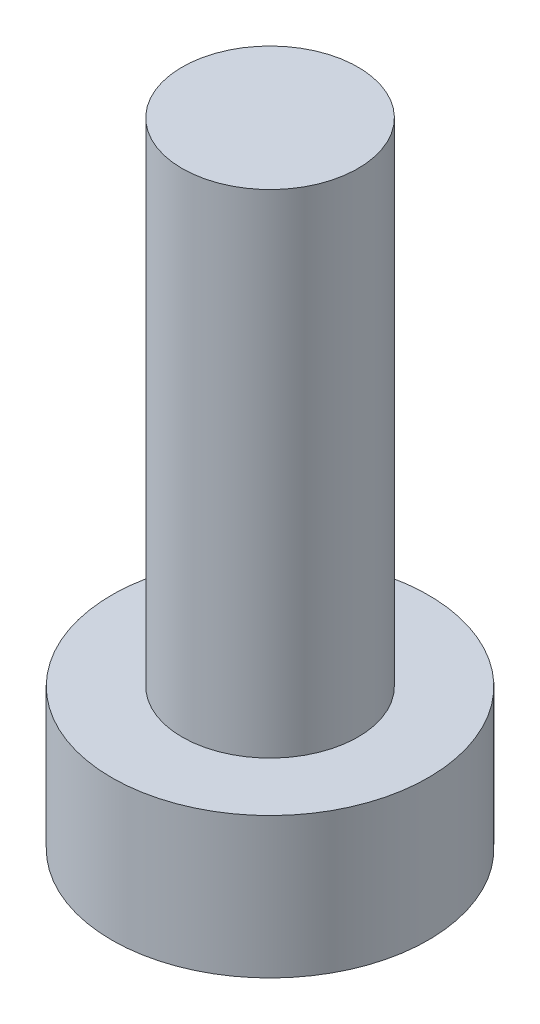
ISO-10303-21;
HEADER;
FILE_DESCRIPTION(('STEP AP214'),'2;1');
FILE_NAME('part.step','',(''),(''),'','','');
FILE_SCHEMA(('AUTOMOTIVE_DESIGN { 1 0 10303 214 1 1 1 1 }'));
ENDSEC;
DATA;
#1=APPLICATION_CONTEXT('core data for automotive mechanical design processes');
#2=APPLICATION_PROTOCOL_DEFINITION('international standard','automotive_design',2000,#1);
#3=PRODUCT_CONTEXT('',#1,'mechanical');
#4=PRODUCT('Part','Part','',(#3));
#5=PRODUCT_RELATED_PRODUCT_CATEGORY('part','',(#4));
#6=PRODUCT_DEFINITION_FORMATION('','',#4);
#7=PRODUCT_DEFINITION_CONTEXT('part definition',#1,'design');
#8=PRODUCT_DEFINITION('design','',#6,#7);
#9=PRODUCT_DEFINITION_SHAPE('','',#8);
#10=(LENGTH_UNIT() NAMED_UNIT(*) SI_UNIT(.MILLI.,.METRE.));
#11=(NAMED_UNIT(*) PLANE_ANGLE_UNIT() SI_UNIT($,.RADIAN.));
#12=(NAMED_UNIT(*) SI_UNIT($,.STERADIAN.) SOLID_ANGLE_UNIT());
#13=UNCERTAINTY_MEASURE_WITH_UNIT(LENGTH_MEASURE(1.E-05),#10,'distance_accuracy_value','');
#14=(GEOMETRIC_REPRESENTATION_CONTEXT(3) GLOBAL_UNCERTAINTY_ASSIGNED_CONTEXT((#13)) GLOBAL_UNIT_ASSIGNED_CONTEXT((#10,
#11,#12)) REPRESENTATION_CONTEXT('',''));
#15=CARTESIAN_POINT('',(0.,0.,0.));
#16=DIRECTION('',(0.,0.,1.));
#17=DIRECTION('',(1.,0.,0.));
#18=AXIS2_PLACEMENT_3D('',#15,#16,#17);
#19=CARTESIAN_POINT('',(26.,-132.,59.966679003209));
#20=DIRECTION('',(0.,1.,0.));
#21=DIRECTION('',(1.,0.,0.));
#22=AXIS2_PLACEMENT_3D('',#19,#20,#21);
#23=PLANE('',#22);
#24=CARTESIAN_POINT('',(26.,-132.,59.966679003209));
#25=DIRECTION('',(0.,1.,0.));
#26=DIRECTION('',(0.,0.,1.));
#27=AXIS2_PLACEMENT_3D('',#24,#25,#26);
#28=CIRCLE('',#27,2.5);
#29=CARTESIAN_POINT('',(26.,-132.,62.466679003209));
#30=VERTEX_POINT('',#29);
#31=EDGE_CURVE('E27',#30,#30,#28,.T.);
#32=ORIENTED_EDGE('',*,*,#31,.T.);
#33=EDGE_LOOP('',(#32));
#34=FACE_BOUND('',#33,.T.);
#35=ADVANCED_FACE('F16',(#34),#23,.T.);
#36=CARTESIAN_POINT('',(26.,-146.,59.966679003209));
#37=DIRECTION('',(0.,1.,0.));
#38=DIRECTION('',(0.,0.,1.));
#39=AXIS2_PLACEMENT_3D('',#36,#37,#38);
#40=CYLINDRICAL_SURFACE('',#39,2.5);
#41=ORIENTED_EDGE('',*,*,#31,.F.);
#42=DIRECTION('',(0.,1.,0.));
#43=VECTOR('',#42,1.);
#44=CARTESIAN_POINT('',(26.,-146.,62.466679003209));
#45=LINE('',#44,#43);
#46=CARTESIAN_POINT('',(26.,-146.,62.466679003209));
#47=VERTEX_POINT('',#46);
#48=EDGE_CURVE('E10',#47,#30,#45,.T.);
#49=ORIENTED_EDGE('',*,*,#48,.F.);
#50=CARTESIAN_POINT('',(26.,-146.,59.966679003209));
#51=DIRECTION('',(0.,1.,0.));
#52=DIRECTION('',(0.,0.,1.));
#53=AXIS2_PLACEMENT_3D('',#50,#51,#52);
#54=CIRCLE('',#53,2.5);
#55=EDGE_CURVE('E56',#47,#47,#54,.T.);
#56=ORIENTED_EDGE('',*,*,#55,.T.);
#57=ORIENTED_EDGE('',*,*,#48,.T.);
#58=EDGE_LOOP('',(#41,#49,#56,#57));
#59=FACE_BOUND('',#58,.T.);
#60=ADVANCED_FACE('F79',(#59),#40,.T.);
#61=CARTESIAN_POINT('',(26.,-150.,59.966679003209));
#62=DIRECTION('',(0.,1.,0.));
#63=DIRECTION('',(1.,0.,0.));
#64=AXIS2_PLACEMENT_3D('',#61,#62,#63);
#65=PLANE('',#64);
#66=CARTESIAN_POINT('',(26.,-150.,59.966679003209));
#67=DIRECTION('',(0.,1.,0.));
#68=DIRECTION('',(0.,0.,1.));
#69=AXIS2_PLACEMENT_3D('',#66,#67,#68);
#70=CIRCLE('',#69,4.5);
#71=CARTESIAN_POINT('',(26.,-150.,64.466679003209));
#72=VERTEX_POINT('',#71);
#73=EDGE_CURVE('E53',#72,#72,#70,.T.);
#74=ORIENTED_EDGE('',*,*,#73,.F.);
#75=EDGE_LOOP('',(#74));
#76=FACE_BOUND('',#75,.T.);
#77=ADVANCED_FACE('F71',(#76),#65,.F.);
#78=CARTESIAN_POINT('',(26.,-146.,59.966679003209));
#79=DIRECTION('',(0.,1.,0.));
#80=DIRECTION('',(1.,0.,0.));
#81=AXIS2_PLACEMENT_3D('',#78,#79,#80);
#82=PLANE('',#81);
#83=ORIENTED_EDGE('',*,*,#55,.F.);
#84=EDGE_LOOP('',(#83));
#85=FACE_BOUND('',#84,.T.);
#86=CARTESIAN_POINT('',(26.,-146.,59.966679003209));
#87=DIRECTION('',(0.,1.,0.));
#88=DIRECTION('',(0.,0.,1.));
#89=AXIS2_PLACEMENT_3D('',#86,#87,#88);
#90=CIRCLE('',#89,4.5);
#91=CARTESIAN_POINT('',(26.,-146.,64.466679003209));
#92=VERTEX_POINT('',#91);
#93=EDGE_CURVE('E63',#92,#92,#90,.T.);
#94=ORIENTED_EDGE('',*,*,#93,.T.);
#95=EDGE_LOOP('',(#94));
#96=FACE_BOUND('',#95,.T.);
#97=ADVANCED_FACE('F69',(#85,#96),#82,.T.);
#98=CARTESIAN_POINT('',(26.,-150.,59.966679003209));
#99=DIRECTION('',(0.,1.,0.));
#100=DIRECTION('',(0.,0.,1.));
#101=AXIS2_PLACEMENT_3D('',#98,#99,#100);
#102=CYLINDRICAL_SURFACE('',#101,4.5);
#103=ORIENTED_EDGE('',*,*,#93,.F.);
#104=DIRECTION('',(0.,1.,0.));
#105=VECTOR('',#104,1.);
#106=CARTESIAN_POINT('',(26.,-150.,64.466679003209));
#107=LINE('',#106,#105);
#108=EDGE_CURVE('E20',#72,#92,#107,.T.);
#109=ORIENTED_EDGE('',*,*,#108,.F.);
#110=ORIENTED_EDGE('',*,*,#73,.T.);
#111=ORIENTED_EDGE('',*,*,#108,.T.);
#112=EDGE_LOOP('',(#103,#109,#110,#111));
#113=FACE_BOUND('',#112,.T.);
#114=ADVANCED_FACE('F18',(#113),#102,.T.);
#115=CLOSED_SHELL('',(#35,#60,#77,#97,#114));
#116=MANIFOLD_SOLID_BREP('B1',#115);
#117=ADVANCED_BREP_SHAPE_REPRESENTATION('',(#18,#116),#14);
#118=SHAPE_DEFINITION_REPRESENTATION(#9,#117);
ENDSEC;
END-ISO-10303-21;
